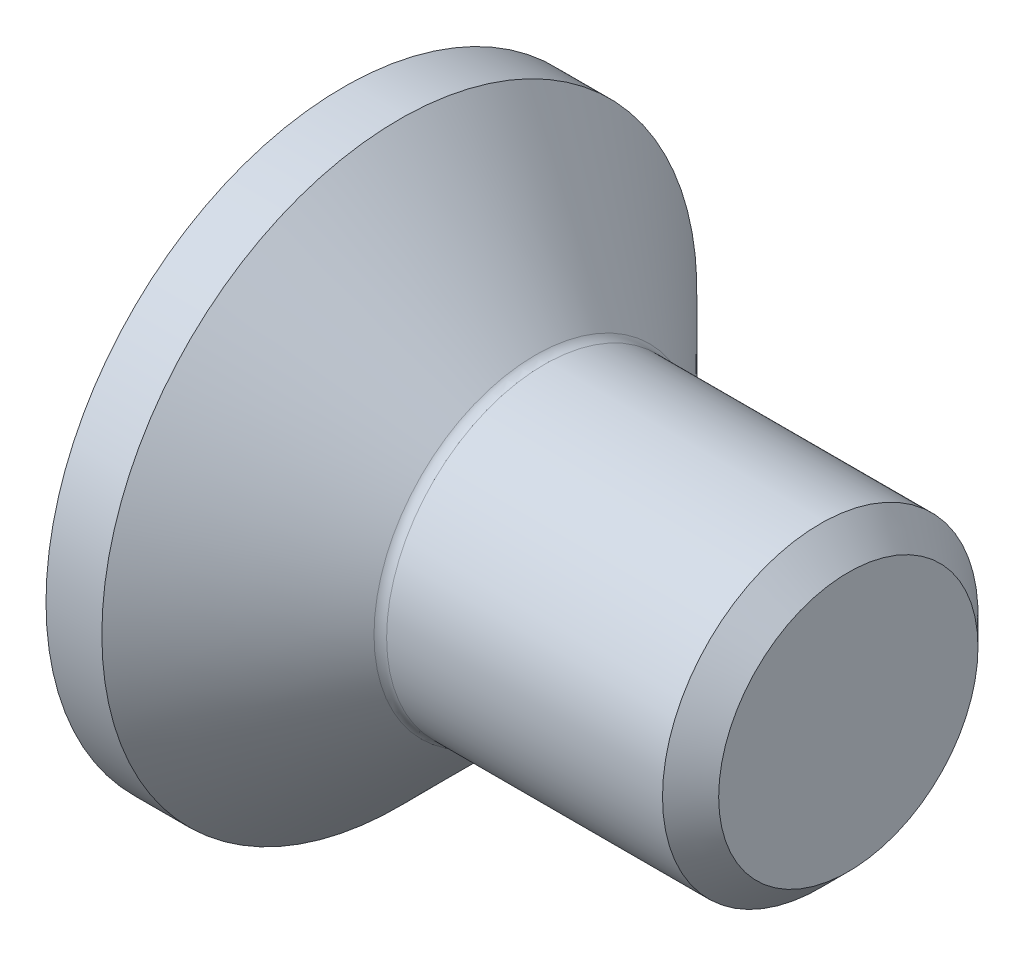
ISO-10303-21;
HEADER;
FILE_DESCRIPTION(('STEP AP214'),'2;1');
FILE_NAME('part.step','',(''),(''),'','','');
FILE_SCHEMA(('AUTOMOTIVE_DESIGN { 1 0 10303 214 1 1 1 1 }'));
ENDSEC;
DATA;
#1=APPLICATION_CONTEXT('core data for automotive mechanical design processes');
#2=APPLICATION_PROTOCOL_DEFINITION('international standard','automotive_design',2000,#1);
#3=PRODUCT_CONTEXT('',#1,'mechanical');
#4=PRODUCT('Part','Part','',(#3));
#5=PRODUCT_RELATED_PRODUCT_CATEGORY('part','',(#4));
#6=PRODUCT_DEFINITION_FORMATION('','',#4);
#7=PRODUCT_DEFINITION_CONTEXT('part definition',#1,'design');
#8=PRODUCT_DEFINITION('design','',#6,#7);
#9=PRODUCT_DEFINITION_SHAPE('','',#8);
#10=(LENGTH_UNIT() NAMED_UNIT(*) SI_UNIT(.MILLI.,.METRE.));
#11=(NAMED_UNIT(*) PLANE_ANGLE_UNIT() SI_UNIT($,.RADIAN.));
#12=(NAMED_UNIT(*) SI_UNIT($,.STERADIAN.) SOLID_ANGLE_UNIT());
#13=UNCERTAINTY_MEASURE_WITH_UNIT(LENGTH_MEASURE(1.E-05),#10,'distance_accuracy_value','');
#14=(GEOMETRIC_REPRESENTATION_CONTEXT(3) GLOBAL_UNCERTAINTY_ASSIGNED_CONTEXT((#13)) GLOBAL_UNIT_ASSIGNED_CONTEXT((#10,
#11,#12)) REPRESENTATION_CONTEXT('',''));
#15=CARTESIAN_POINT('',(0.,0.,0.));
#16=DIRECTION('',(0.,0.,1.));
#17=DIRECTION('',(1.,0.,0.));
#18=AXIS2_PLACEMENT_3D('',#15,#16,#17);
#19=CARTESIAN_POINT('',(0.,0.,0.));
#20=DIRECTION('',(-1.,0.,0.));
#21=DIRECTION('',(0.,0.,1.));
#22=AXIS2_PLACEMENT_3D('',#19,#20,#21);
#23=PLANE('',#22);
#24=CARTESIAN_POINT('',(0.,0.,0.));
#25=DIRECTION('',(-1.,0.,0.));
#26=DIRECTION('',(0.,0.,1.));
#27=AXIS2_PLACEMENT_3D('',#24,#25,#26);
#28=CIRCLE('',#27,4.715);
#29=CARTESIAN_POINT('',(0.,0.,4.715));
#30=VERTEX_POINT('',#29);
#31=EDGE_CURVE('E154',#30,#30,#28,.T.);
#32=ORIENTED_EDGE('',*,*,#31,.T.);
#33=EDGE_LOOP('',(#32));
#34=FACE_BOUND('',#33,.T.);
#35=DIRECTION('',(0.,-0.5,-0.866025403784439));
#36=VECTOR('',#35,1.);
#37=CARTESIAN_POINT('',(0.,-0.866025403784439,1.5));
#38=LINE('',#37,#36);
#39=CARTESIAN_POINT('',(0.,-0.866025403784439,1.5));
#40=VERTEX_POINT('',#39);
#41=CARTESIAN_POINT('',(0.,-1.73205080756888,0.));
#42=VERTEX_POINT('',#41);
#43=EDGE_CURVE('E120',#40,#42,#38,.T.);
#44=ORIENTED_EDGE('',*,*,#43,.T.);
#45=DIRECTION('',(0.,0.5,-0.866025403784439));
#46=VECTOR('',#45,1.);
#47=CARTESIAN_POINT('',(0.,-1.73205080756888,0.));
#48=LINE('',#47,#46);
#49=CARTESIAN_POINT('',(0.,-0.866025403784439,-1.5));
#50=VERTEX_POINT('',#49);
#51=EDGE_CURVE('E51',#42,#50,#48,.T.);
#52=ORIENTED_EDGE('',*,*,#51,.T.);
#53=DIRECTION('',(0.,1.,0.));
#54=VECTOR('',#53,1.);
#55=CARTESIAN_POINT('',(0.,-0.866025403784439,-1.5));
#56=LINE('',#55,#54);
#57=CARTESIAN_POINT('',(0.,0.866025403784438,-1.5));
#58=VERTEX_POINT('',#57);
#59=EDGE_CURVE('E131',#50,#58,#56,.T.);
#60=ORIENTED_EDGE('',*,*,#59,.T.);
#61=DIRECTION('',(0.,0.5,0.866025403784438));
#62=VECTOR('',#61,1.);
#63=CARTESIAN_POINT('',(0.,0.866025403784438,-1.5));
#64=LINE('',#63,#62);
#65=CARTESIAN_POINT('',(0.,1.73205080756888,0.));
#66=VERTEX_POINT('',#65);
#67=EDGE_CURVE('E255',#58,#66,#64,.T.);
#68=ORIENTED_EDGE('',*,*,#67,.T.);
#69=DIRECTION('',(0.,-0.5,0.866025403784439));
#70=VECTOR('',#69,1.);
#71=CARTESIAN_POINT('',(0.,1.73205080756888,0.));
#72=LINE('',#71,#70);
#73=CARTESIAN_POINT('',(0.,0.866025403784438,1.5));
#74=VERTEX_POINT('',#73);
#75=EDGE_CURVE('E258',#66,#74,#72,.T.);
#76=ORIENTED_EDGE('',*,*,#75,.T.);
#77=DIRECTION('',(0.,-1.,0.));
#78=VECTOR('',#77,1.);
#79=CARTESIAN_POINT('',(0.,0.866025403784438,1.5));
#80=LINE('',#79,#78);
#81=EDGE_CURVE('E261',#74,#40,#80,.T.);
#82=ORIENTED_EDGE('',*,*,#81,.T.);
#83=EDGE_LOOP('',(#44,#52,#60,#68,#76,#82));
#84=FACE_BOUND('',#83,.T.);
#85=ADVANCED_FACE('F36',(#34,#84),#23,.T.);
#86=CARTESIAN_POINT('',(0.,0.,0.));
#87=DIRECTION('',(-1.,0.,0.));
#88=DIRECTION('',(0.,0.,1.));
#89=AXIS2_PLACEMENT_3D('',#86,#87,#88);
#90=CYLINDRICAL_SURFACE('',#89,4.715);
#91=CARTESIAN_POINT('',(0.88500000000001,0.,0.));
#92=DIRECTION('',(-1.,0.,0.));
#93=DIRECTION('',(0.,0.,1.));
#94=AXIS2_PLACEMENT_3D('',#91,#92,#93);
#95=CIRCLE('',#94,4.715);
#96=CARTESIAN_POINT('',(0.88500000000001,0.,4.715));
#97=VERTEX_POINT('',#96);
#98=EDGE_CURVE('E151',#97,#97,#95,.T.);
#99=ORIENTED_EDGE('',*,*,#98,.T.);
#100=EDGE_LOOP('',(#99));
#101=FACE_BOUND('',#100,.T.);
#102=ORIENTED_EDGE('',*,*,#31,.F.);
#103=EDGE_LOOP('',(#102));
#104=FACE_BOUND('',#103,.T.);
#105=ADVANCED_FACE('F175',(#101,#104),#90,.T.);
#106=CARTESIAN_POINT('',(0.88500000000001,0.,0.));
#107=DIRECTION('',(-1.,0.,0.));
#108=DIRECTION('',(0.,0.,1.));
#109=AXIS2_PLACEMENT_3D('',#106,#107,#108);
#110=CONICAL_SURFACE('',#109,4.715,0.78539816339745);
#111=CARTESIAN_POINT('',(3.04142135623731,0.,0.));
#112=DIRECTION('',(-1.,0.,0.));
#113=DIRECTION('',(0.,0.,1.));
#114=AXIS2_PLACEMENT_3D('',#111,#112,#113);
#115=CIRCLE('',#114,2.55857864376269);
#116=CARTESIAN_POINT('',(3.04142135623731,0.,2.55857864376269));
#117=VERTEX_POINT('',#116);
#118=EDGE_CURVE('E44',#117,#117,#115,.T.);
#119=ORIENTED_EDGE('',*,*,#118,.T.);
#120=EDGE_LOOP('',(#119));
#121=FACE_BOUND('',#120,.T.);
#122=ORIENTED_EDGE('',*,*,#98,.F.);
#123=EDGE_LOOP('',(#122));
#124=FACE_BOUND('',#123,.T.);
#125=ADVANCED_FACE('F159',(#121,#124),#110,.T.);
#126=CARTESIAN_POINT('',(0.,0.,0.));
#127=DIRECTION('',(-1.,0.,0.));
#128=DIRECTION('',(0.,0.,1.));
#129=AXIS2_PLACEMENT_3D('',#126,#127,#128);
#130=CYLINDRICAL_SURFACE('',#129,2.5);
#131=CARTESIAN_POINT('',(3.18284271247462,0.,0.));
#132=DIRECTION('',(-1.,0.,0.));
#133=DIRECTION('',(0.,0.,1.));
#134=AXIS2_PLACEMENT_3D('',#131,#132,#133);
#135=CIRCLE('',#134,2.5);
#136=CARTESIAN_POINT('',(3.18284271247462,0.,2.5));
#137=VERTEX_POINT('',#136);
#138=EDGE_CURVE('E11',#137,#137,#135,.F.);
#139=ORIENTED_EDGE('',*,*,#138,.T.);
#140=EDGE_LOOP('',(#139));
#141=FACE_BOUND('',#140,.T.);
#142=CARTESIAN_POINT('',(7.55500000000001,0.,0.));
#143=DIRECTION('',(-1.,0.,0.));
#144=DIRECTION('',(0.,0.,1.));
#145=AXIS2_PLACEMENT_3D('',#142,#143,#144);
#146=CIRCLE('',#145,2.5);
#147=CARTESIAN_POINT('',(7.55500000000001,0.,2.5));
#148=VERTEX_POINT('',#147);
#149=EDGE_CURVE('E148',#148,#148,#146,.T.);
#150=ORIENTED_EDGE('',*,*,#149,.T.);
#151=EDGE_LOOP('',(#150));
#152=FACE_BOUND('',#151,.T.);
#153=ADVANCED_FACE('F186',(#141,#152),#130,.T.);
#154=CARTESIAN_POINT('',(7.99999999999999,0.,0.));
#155=DIRECTION('',(-1.,0.,0.));
#156=DIRECTION('',(0.,0.,1.));
#157=AXIS2_PLACEMENT_3D('',#154,#155,#156);
#158=CONICAL_SURFACE('',#157,2.055,0.785398163397468);
#159=ORIENTED_EDGE('',*,*,#149,.F.);
#160=EDGE_LOOP('',(#159));
#161=FACE_BOUND('',#160,.T.);
#162=CARTESIAN_POINT('',(7.99999999999999,0.,0.));
#163=DIRECTION('',(-1.,0.,0.));
#164=DIRECTION('',(0.,0.,1.));
#165=AXIS2_PLACEMENT_3D('',#162,#163,#164);
#166=CIRCLE('',#165,2.055);
#167=CARTESIAN_POINT('',(7.99999999999999,0.,2.055));
#168=VERTEX_POINT('',#167);
#169=EDGE_CURVE('E144',#168,#168,#166,.T.);
#170=ORIENTED_EDGE('',*,*,#169,.T.);
#171=EDGE_LOOP('',(#170));
#172=FACE_BOUND('',#171,.T.);
#173=ADVANCED_FACE('F170',(#161,#172),#158,.T.);
#174=CARTESIAN_POINT('',(7.99999999999999,2.055,0.));
#175=DIRECTION('',(1.,0.,0.));
#176=DIRECTION('',(0.,0.,-1.));
#177=AXIS2_PLACEMENT_3D('',#174,#175,#176);
#178=PLANE('',#177);
#179=ORIENTED_EDGE('',*,*,#169,.F.);
#180=EDGE_LOOP('',(#179));
#181=FACE_BOUND('',#180,.T.);
#182=ADVANCED_FACE('F163',(#181),#178,.T.);
#183=CARTESIAN_POINT('',(3.18284271247462,0.,0.));
#184=DIRECTION('',(-1.,0.,0.));
#185=DIRECTION('',(0.,0.,1.));
#186=AXIS2_PLACEMENT_3D('',#183,#184,#185);
#187=TOROIDAL_SURFACE('',#186,2.7,0.2);
#188=ORIENTED_EDGE('',*,*,#138,.F.);
#189=EDGE_LOOP('',(#188));
#190=FACE_BOUND('',#189,.T.);
#191=ORIENTED_EDGE('',*,*,#118,.F.);
#192=EDGE_LOOP('',(#191));
#193=FACE_BOUND('',#192,.T.);
#194=ADVANCED_FACE('F38',(#190,#193),#187,.F.);
#195=CARTESIAN_POINT('',(1.9,-1.73205080756888,0.));
#196=DIRECTION('',(0.,0.866025403784439,0.5));
#197=DIRECTION('',(0.,-0.5,0.866025403784439));
#198=AXIS2_PLACEMENT_3D('',#195,#196,#197);
#199=PLANE('',#198);
#200=ORIENTED_EDGE('',*,*,#51,.F.);
#201=DIRECTION('',(-1.,0.,0.));
#202=VECTOR('',#201,1.);
#203=CARTESIAN_POINT('',(1.9,-1.73205080756888,0.));
#204=LINE('',#203,#202);
#205=CARTESIAN_POINT('',(1.9,-1.73205080756888,0.));
#206=VERTEX_POINT('',#205);
#207=EDGE_CURVE('E252',#206,#42,#204,.T.);
#208=ORIENTED_EDGE('',*,*,#207,.F.);
#209=DIRECTION('',(0.,0.5,-0.866025403784439));
#210=VECTOR('',#209,1.);
#211=CARTESIAN_POINT('',(1.9,-1.73205080756888,0.));
#212=LINE('',#211,#210);
#213=CARTESIAN_POINT('',(1.9,-1.29903810567666,-0.75));
#214=VERTEX_POINT('',#213);
#215=EDGE_CURVE('E116',#206,#214,#212,.T.);
#216=ORIENTED_EDGE('',*,*,#215,.T.);
#217=CARTESIAN_POINT('',(1.9,-0.866025403784439,-1.5));
#218=VERTEX_POINT('',#217);
#219=EDGE_CURVE('E112',#214,#218,#212,.T.);
#220=ORIENTED_EDGE('',*,*,#219,.T.);
#221=DIRECTION('',(-1.,0.,0.));
#222=VECTOR('',#221,1.);
#223=CARTESIAN_POINT('',(1.9,-0.866025403784439,-1.5));
#224=LINE('',#223,#222);
#225=EDGE_CURVE('E114',#218,#50,#224,.T.);
#226=ORIENTED_EDGE('',*,*,#225,.T.);
#227=EDGE_LOOP('',(#200,#208,#216,#220,#226));
#228=FACE_BOUND('',#227,.T.);
#229=ADVANCED_FACE('F113',(#228),#199,.T.);
#230=CARTESIAN_POINT('',(1.9,-0.866025403784439,-1.5));
#231=DIRECTION('',(0.,0.,1.));
#232=DIRECTION('',(0.,-1.,0.));
#233=AXIS2_PLACEMENT_3D('',#230,#231,#232);
#234=PLANE('',#233);
#235=ORIENTED_EDGE('',*,*,#59,.F.);
#236=ORIENTED_EDGE('',*,*,#225,.F.);
#237=DIRECTION('',(0.,1.,0.));
#238=VECTOR('',#237,1.);
#239=CARTESIAN_POINT('',(1.9,-0.866025403784439,-1.5));
#240=LINE('',#239,#238);
#241=CARTESIAN_POINT('',(1.9,0.,-1.5));
#242=VERTEX_POINT('',#241);
#243=EDGE_CURVE('E59',#218,#242,#240,.T.);
#244=ORIENTED_EDGE('',*,*,#243,.T.);
#245=CARTESIAN_POINT('',(1.9,0.866025403784438,-1.5));
#246=VERTEX_POINT('',#245);
#247=EDGE_CURVE('E126',#242,#246,#240,.T.);
#248=ORIENTED_EDGE('',*,*,#247,.T.);
#249=DIRECTION('',(-1.,0.,0.));
#250=VECTOR('',#249,1.);
#251=CARTESIAN_POINT('',(1.9,0.866025403784438,-1.5));
#252=LINE('',#251,#250);
#253=EDGE_CURVE('E133',#246,#58,#252,.T.);
#254=ORIENTED_EDGE('',*,*,#253,.T.);
#255=EDGE_LOOP('',(#235,#236,#244,#248,#254));
#256=FACE_BOUND('',#255,.T.);
#257=ADVANCED_FACE('F128',(#256),#234,.T.);
#258=CARTESIAN_POINT('',(1.9,0.866025403784438,-1.5));
#259=DIRECTION('',(0.,-0.866025403784439,0.5));
#260=DIRECTION('',(0.,-0.5,-0.866025403784439));
#261=AXIS2_PLACEMENT_3D('',#258,#259,#260);
#262=PLANE('',#261);
#263=ORIENTED_EDGE('',*,*,#67,.F.);
#264=ORIENTED_EDGE('',*,*,#253,.F.);
#265=DIRECTION('',(0.,0.5,0.866025403784438));
#266=VECTOR('',#265,1.);
#267=CARTESIAN_POINT('',(1.9,0.866025403784438,-1.5));
#268=LINE('',#267,#266);
#269=CARTESIAN_POINT('',(1.9,1.29903810567666,-0.75));
#270=VERTEX_POINT('',#269);
#271=EDGE_CURVE('E233',#246,#270,#268,.T.);
#272=ORIENTED_EDGE('',*,*,#271,.T.);
#273=CARTESIAN_POINT('',(1.9,1.73205080756888,0.));
#274=VERTEX_POINT('',#273);
#275=EDGE_CURVE('E125',#270,#274,#268,.T.);
#276=ORIENTED_EDGE('',*,*,#275,.T.);
#277=DIRECTION('',(-1.,0.,0.));
#278=VECTOR('',#277,1.);
#279=CARTESIAN_POINT('',(1.9,1.73205080756888,0.));
#280=LINE('',#279,#278);
#281=EDGE_CURVE('E139',#274,#66,#280,.T.);
#282=ORIENTED_EDGE('',*,*,#281,.T.);
#283=EDGE_LOOP('',(#263,#264,#272,#276,#282));
#284=FACE_BOUND('',#283,.T.);
#285=ADVANCED_FACE('F200',(#284),#262,.T.);
#286=CARTESIAN_POINT('',(1.9,1.73205080756888,0.));
#287=DIRECTION('',(0.,-0.866025403784438,-0.5));
#288=DIRECTION('',(0.,0.5,-0.866025403784438));
#289=AXIS2_PLACEMENT_3D('',#286,#287,#288);
#290=PLANE('',#289);
#291=ORIENTED_EDGE('',*,*,#75,.F.);
#292=ORIENTED_EDGE('',*,*,#281,.F.);
#293=DIRECTION('',(0.,-0.5,0.866025403784439));
#294=VECTOR('',#293,1.);
#295=CARTESIAN_POINT('',(1.9,1.73205080756888,0.));
#296=LINE('',#295,#294);
#297=CARTESIAN_POINT('',(1.9,1.29903810567666,0.750000000000001));
#298=VERTEX_POINT('',#297);
#299=EDGE_CURVE('E240',#274,#298,#296,.T.);
#300=ORIENTED_EDGE('',*,*,#299,.T.);
#301=CARTESIAN_POINT('',(1.9,0.866025403784438,1.5));
#302=VERTEX_POINT('',#301);
#303=EDGE_CURVE('E238',#298,#302,#296,.T.);
#304=ORIENTED_EDGE('',*,*,#303,.T.);
#305=DIRECTION('',(-1.,0.,0.));
#306=VECTOR('',#305,1.);
#307=CARTESIAN_POINT('',(1.9,0.866025403784438,1.5));
#308=LINE('',#307,#306);
#309=EDGE_CURVE('E270',#302,#74,#308,.T.);
#310=ORIENTED_EDGE('',*,*,#309,.T.);
#311=EDGE_LOOP('',(#291,#292,#300,#304,#310));
#312=FACE_BOUND('',#311,.T.);
#313=ADVANCED_FACE('F203',(#312),#290,.T.);
#314=CARTESIAN_POINT('',(1.9,0.866025403784438,1.5));
#315=DIRECTION('',(0.,0.,-1.));
#316=DIRECTION('',(-1.,0.,0.));
#317=AXIS2_PLACEMENT_3D('',#314,#315,#316);
#318=PLANE('',#317);
#319=ORIENTED_EDGE('',*,*,#81,.F.);
#320=ORIENTED_EDGE('',*,*,#309,.F.);
#321=DIRECTION('',(0.,-1.,0.));
#322=VECTOR('',#321,1.);
#323=CARTESIAN_POINT('',(1.9,0.866025403784438,1.5));
#324=LINE('',#323,#322);
#325=CARTESIAN_POINT('',(1.9,0.,1.5));
#326=VERTEX_POINT('',#325);
#327=EDGE_CURVE('E245',#302,#326,#324,.T.);
#328=ORIENTED_EDGE('',*,*,#327,.T.);
#329=CARTESIAN_POINT('',(1.9,-0.866025403784439,1.5));
#330=VERTEX_POINT('',#329);
#331=EDGE_CURVE('E244',#326,#330,#324,.T.);
#332=ORIENTED_EDGE('',*,*,#331,.T.);
#333=DIRECTION('',(-1.,0.,0.));
#334=VECTOR('',#333,1.);
#335=CARTESIAN_POINT('',(1.9,-0.866025403784439,1.5));
#336=LINE('',#335,#334);
#337=EDGE_CURVE('E267',#330,#40,#336,.T.);
#338=ORIENTED_EDGE('',*,*,#337,.T.);
#339=EDGE_LOOP('',(#319,#320,#328,#332,#338));
#340=FACE_BOUND('',#339,.T.);
#341=ADVANCED_FACE('F207',(#340),#318,.T.);
#342=CARTESIAN_POINT('',(1.9,-0.866025403784439,1.5));
#343=DIRECTION('',(0.,0.866025403784439,-0.5));
#344=DIRECTION('',(0.,0.5,0.866025403784439));
#345=AXIS2_PLACEMENT_3D('',#342,#343,#344);
#346=PLANE('',#345);
#347=ORIENTED_EDGE('',*,*,#43,.F.);
#348=ORIENTED_EDGE('',*,*,#337,.F.);
#349=DIRECTION('',(0.,-0.5,-0.866025403784439));
#350=VECTOR('',#349,1.);
#351=CARTESIAN_POINT('',(1.9,-0.866025403784439,1.5));
#352=LINE('',#351,#350);
#353=CARTESIAN_POINT('',(1.9,-1.29903810567666,0.75));
#354=VERTEX_POINT('',#353);
#355=EDGE_CURVE('E249',#330,#354,#352,.T.);
#356=ORIENTED_EDGE('',*,*,#355,.T.);
#357=EDGE_CURVE('E248',#354,#206,#352,.T.);
#358=ORIENTED_EDGE('',*,*,#357,.T.);
#359=ORIENTED_EDGE('',*,*,#207,.T.);
#360=EDGE_LOOP('',(#347,#348,#356,#358,#359));
#361=FACE_BOUND('',#360,.T.);
#362=ADVANCED_FACE('F211',(#361),#346,.T.);
#363=CARTESIAN_POINT('',(1.9,0.,-3.));
#364=DIRECTION('',(1.,0.,0.));
#365=DIRECTION('',(0.,0.,-1.));
#366=AXIS2_PLACEMENT_3D('',#363,#364,#365);
#367=PLANE('',#366);
#368=ORIENTED_EDGE('',*,*,#243,.F.);
#369=ORIENTED_EDGE('',*,*,#219,.F.);
#370=CARTESIAN_POINT('',(1.9,0.,0.));
#371=DIRECTION('',(-1.,0.,0.));
#372=DIRECTION('',(0.,0.,1.));
#373=AXIS2_PLACEMENT_3D('',#370,#371,#372);
#374=CIRCLE('',#373,1.5);
#375=EDGE_CURVE('E123',#242,#214,#374,.T.);
#376=ORIENTED_EDGE('',*,*,#375,.F.);
#377=EDGE_LOOP('',(#368,#369,#376));
#378=FACE_BOUND('',#377,.T.);
#379=ADVANCED_FACE('F122',(#378),#367,.F.);
#380=ORIENTED_EDGE('',*,*,#215,.F.);
#381=ORIENTED_EDGE('',*,*,#357,.F.);
#382=EDGE_CURVE('E136',#214,#354,#374,.T.);
#383=ORIENTED_EDGE('',*,*,#382,.F.);
#384=EDGE_LOOP('',(#380,#381,#383));
#385=FACE_BOUND('',#384,.T.);
#386=ADVANCED_FACE('F217',(#385),#367,.F.);
#387=ORIENTED_EDGE('',*,*,#355,.F.);
#388=ORIENTED_EDGE('',*,*,#331,.F.);
#389=EDGE_CURVE('E132',#354,#326,#374,.T.);
#390=ORIENTED_EDGE('',*,*,#389,.F.);
#391=EDGE_LOOP('',(#387,#388,#390));
#392=FACE_BOUND('',#391,.T.);
#393=ADVANCED_FACE('F221',(#392),#367,.F.);
#394=ORIENTED_EDGE('',*,*,#327,.F.);
#395=ORIENTED_EDGE('',*,*,#303,.F.);
#396=EDGE_CURVE('E138',#326,#298,#374,.T.);
#397=ORIENTED_EDGE('',*,*,#396,.F.);
#398=EDGE_LOOP('',(#394,#395,#397));
#399=FACE_BOUND('',#398,.T.);
#400=ADVANCED_FACE('F229',(#399),#367,.F.);
#401=ORIENTED_EDGE('',*,*,#299,.F.);
#402=ORIENTED_EDGE('',*,*,#275,.F.);
#403=EDGE_CURVE('E145',#298,#270,#374,.T.);
#404=ORIENTED_EDGE('',*,*,#403,.F.);
#405=EDGE_LOOP('',(#401,#402,#404));
#406=FACE_BOUND('',#405,.T.);
#407=ADVANCED_FACE('F224',(#406),#367,.F.);
#408=ORIENTED_EDGE('',*,*,#271,.F.);
#409=ORIENTED_EDGE('',*,*,#247,.F.);
#410=EDGE_CURVE('E234',#270,#242,#374,.T.);
#411=ORIENTED_EDGE('',*,*,#410,.F.);
#412=EDGE_LOOP('',(#408,#409,#411));
#413=FACE_BOUND('',#412,.T.);
#414=ADVANCED_FACE('F195',(#413),#367,.F.);
#415=CARTESIAN_POINT('',(1.9,0.,0.));
#416=DIRECTION('',(-1.,0.,0.));
#417=DIRECTION('',(0.,0.,1.));
#418=AXIS2_PLACEMENT_3D('',#415,#416,#417);
#419=CONICAL_SURFACE('',#418,1.5,1.04719755119659);
#420=CARTESIAN_POINT('',(2.76602540378445,0.,0.));
#421=VERTEX_POINT('',#420);
#422=VERTEX_LOOP('',#421);
#423=FACE_BOUND('',#422,.T.);
#424=ORIENTED_EDGE('',*,*,#396,.T.);
#425=ORIENTED_EDGE('',*,*,#403,.T.);
#426=ORIENTED_EDGE('',*,*,#410,.T.);
#427=ORIENTED_EDGE('',*,*,#375,.T.);
#428=ORIENTED_EDGE('',*,*,#382,.T.);
#429=ORIENTED_EDGE('',*,*,#389,.T.);
#430=EDGE_LOOP('',(#424,#425,#426,#427,#428,#429));
#431=FACE_BOUND('',#430,.T.);
#432=ADVANCED_FACE('F193',(#423,#431),#419,.F.);
#433=CLOSED_SHELL('',(#85,#105,#125,#153,#173,#182,#194,#229,#257,#285,#313,#341,#362,#379,#386,
#393,#400,#407,#414,#432));
#434=MANIFOLD_SOLID_BREP('B2',#433);
#435=ADVANCED_BREP_SHAPE_REPRESENTATION('',(#18,#434),#14);
#436=SHAPE_DEFINITION_REPRESENTATION(#9,#435);
ENDSEC;
END-ISO-10303-21;
